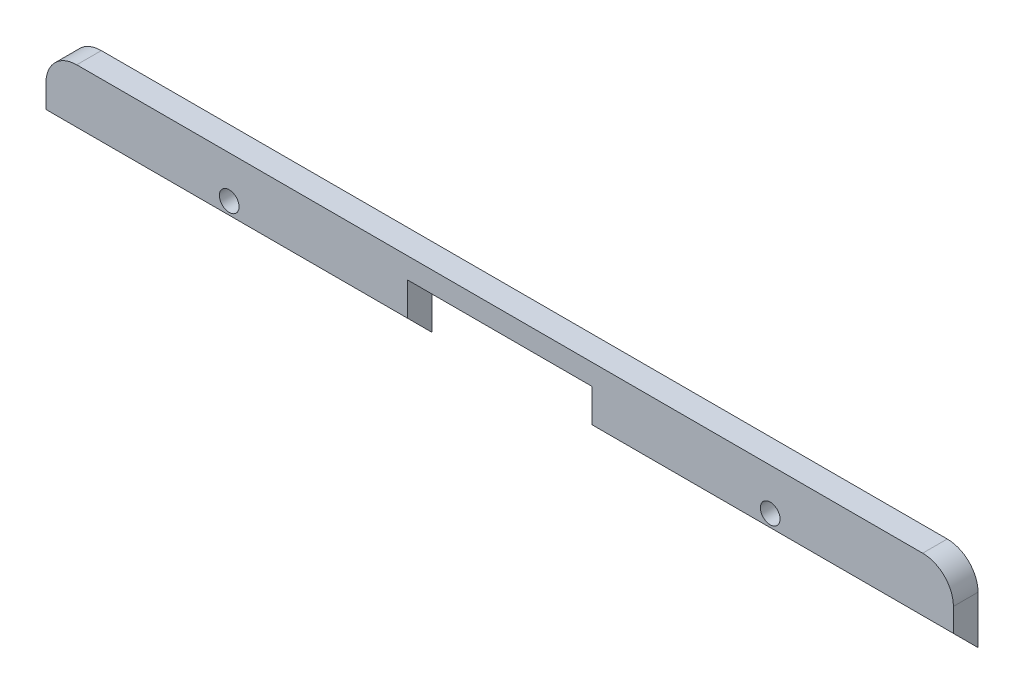
ISO-10303-21;
HEADER;
FILE_DESCRIPTION(('STEP AP214'),'2;1');
FILE_NAME('part.step','',(''),(''),'','','');
FILE_SCHEMA(('AUTOMOTIVE_DESIGN { 1 0 10303 214 1 1 1 1 }'));
ENDSEC;
DATA;
#1=APPLICATION_CONTEXT('core data for automotive mechanical design processes');
#2=APPLICATION_PROTOCOL_DEFINITION('international standard','automotive_design',2000,#1);
#3=PRODUCT_CONTEXT('',#1,'mechanical');
#4=PRODUCT('Part','Part','',(#3));
#5=PRODUCT_RELATED_PRODUCT_CATEGORY('part','',(#4));
#6=PRODUCT_DEFINITION_FORMATION('','',#4);
#7=PRODUCT_DEFINITION_CONTEXT('part definition',#1,'design');
#8=PRODUCT_DEFINITION('design','',#6,#7);
#9=PRODUCT_DEFINITION_SHAPE('','',#8);
#10=(LENGTH_UNIT() NAMED_UNIT(*) SI_UNIT(.MILLI.,.METRE.));
#11=(NAMED_UNIT(*) PLANE_ANGLE_UNIT() SI_UNIT($,.RADIAN.));
#12=(NAMED_UNIT(*) SI_UNIT($,.STERADIAN.) SOLID_ANGLE_UNIT());
#13=UNCERTAINTY_MEASURE_WITH_UNIT(LENGTH_MEASURE(1.E-05),#10,'distance_accuracy_value','');
#14=(GEOMETRIC_REPRESENTATION_CONTEXT(3) GLOBAL_UNCERTAINTY_ASSIGNED_CONTEXT((#13)) GLOBAL_UNIT_ASSIGNED_CONTEXT((#10,
#11,#12)) REPRESENTATION_CONTEXT('',''));
#15=CARTESIAN_POINT('',(0.,0.,0.));
#16=DIRECTION('',(0.,0.,1.));
#17=DIRECTION('',(1.,0.,0.));
#18=AXIS2_PLACEMENT_3D('',#15,#16,#17);
#19=CARTESIAN_POINT('',(36.9,-3.2,0.));
#20=DIRECTION('',(0.,0.,1.));
#21=DIRECTION('',(1.,0.,0.));
#22=AXIS2_PLACEMENT_3D('',#19,#20,#21);
#23=PLANE('',#22);
#24=CARTESIAN_POINT('',(-22.,-0.199999999999971,0.));
#25=DIRECTION('',(0.,0.,1.));
#26=DIRECTION('',(1.,0.,0.));
#27=AXIS2_PLACEMENT_3D('',#24,#25,#26);
#28=CIRCLE('',#27,0.799999999999988);
#29=CARTESIAN_POINT('',(-21.2,-0.199999999999971,0.));
#30=VERTEX_POINT('',#29);
#31=EDGE_CURVE('E176',#30,#30,#28,.T.);
#32=ORIENTED_EDGE('',*,*,#31,.T.);
#33=EDGE_LOOP('',(#32));
#34=FACE_BOUND('',#33,.T.);
#35=CARTESIAN_POINT('',(22.,-0.199999999999978,0.));
#36=DIRECTION('',(0.,0.,1.));
#37=DIRECTION('',(1.,0.,0.));
#38=AXIS2_PLACEMENT_3D('',#35,#36,#37);
#39=CIRCLE('',#38,0.799999999999988);
#40=CARTESIAN_POINT('',(22.8,-0.199999999999978,0.));
#41=VERTEX_POINT('',#40);
#42=EDGE_CURVE('E168',#41,#41,#39,.T.);
#43=ORIENTED_EDGE('',*,*,#42,.T.);
#44=EDGE_LOOP('',(#43));
#45=FACE_BOUND('',#44,.T.);
#46=DIRECTION('',(0.,1.,0.));
#47=VECTOR('',#46,1.);
#48=CARTESIAN_POINT('',(-36.9,-3.2,0.));
#49=LINE('',#48,#47);
#50=CARTESIAN_POINT('',(-36.9,-3.2,0.));
#51=VERTEX_POINT('',#50);
#52=CARTESIAN_POINT('',(-36.9,0.7,0.));
#53=VERTEX_POINT('',#52);
#54=EDGE_CURVE('E180',#51,#53,#49,.T.);
#55=ORIENTED_EDGE('',*,*,#54,.T.);
#56=CARTESIAN_POINT('',(-34.4,0.7,0.));
#57=DIRECTION('',(0.,0.,1.));
#58=DIRECTION('',(1.,0.,0.));
#59=AXIS2_PLACEMENT_3D('',#56,#57,#58);
#60=CIRCLE('',#59,2.5);
#61=CARTESIAN_POINT('',(-34.4,3.2,0.));
#62=VERTEX_POINT('',#61);
#63=EDGE_CURVE('E47',#53,#62,#60,.F.);
#64=ORIENTED_EDGE('',*,*,#63,.T.);
#65=DIRECTION('',(-1.,0.,0.));
#66=VECTOR('',#65,1.);
#67=CARTESIAN_POINT('',(36.9,3.2,0.));
#68=LINE('',#67,#66);
#69=CARTESIAN_POINT('',(34.4,3.2,0.));
#70=VERTEX_POINT('',#69);
#71=EDGE_CURVE('E211',#70,#62,#68,.T.);
#72=ORIENTED_EDGE('',*,*,#71,.F.);
#73=CARTESIAN_POINT('',(34.4,0.7,0.));
#74=DIRECTION('',(0.,0.,1.));
#75=DIRECTION('',(1.,0.,0.));
#76=AXIS2_PLACEMENT_3D('',#73,#74,#75);
#77=CIRCLE('',#76,2.5);
#78=CARTESIAN_POINT('',(36.9,0.7,0.));
#79=VERTEX_POINT('',#78);
#80=EDGE_CURVE('E54',#70,#79,#77,.F.);
#81=ORIENTED_EDGE('',*,*,#80,.T.);
#82=DIRECTION('',(0.,1.,0.));
#83=VECTOR('',#82,1.);
#84=CARTESIAN_POINT('',(36.9,-3.2,0.));
#85=LINE('',#84,#83);
#86=CARTESIAN_POINT('',(36.9,-3.2,0.));
#87=VERTEX_POINT('',#86);
#88=EDGE_CURVE('E181',#87,#79,#85,.T.);
#89=ORIENTED_EDGE('',*,*,#88,.F.);
#90=DIRECTION('',(-1.,0.,0.));
#91=VECTOR('',#90,1.);
#92=CARTESIAN_POINT('',(36.9,-3.2,0.));
#93=LINE('',#92,#91);
#94=CARTESIAN_POINT('',(7.50000000000002,-3.20000000000006,0.));
#95=VERTEX_POINT('',#94);
#96=EDGE_CURVE('E200',#87,#95,#93,.T.);
#97=ORIENTED_EDGE('',*,*,#96,.T.);
#98=DIRECTION('',(0.,1.,0.));
#99=VECTOR('',#98,1.);
#100=CARTESIAN_POINT('',(7.50000000000001,1.49999999999994,0.));
#101=LINE('',#100,#99);
#102=CARTESIAN_POINT('',(7.50000000000001,1.49999999999994,0.));
#103=VERTEX_POINT('',#102);
#104=EDGE_CURVE('E155',#95,#103,#101,.T.);
#105=ORIENTED_EDGE('',*,*,#104,.T.);
#106=DIRECTION('',(-1.,0.,0.));
#107=VECTOR('',#106,1.);
#108=CARTESIAN_POINT('',(7.50000000000001,1.49999999999994,0.));
#109=LINE('',#108,#107);
#110=CARTESIAN_POINT('',(-7.50000000000001,1.49999999999994,0.));
#111=VERTEX_POINT('',#110);
#112=EDGE_CURVE('E139',#103,#111,#109,.T.);
#113=ORIENTED_EDGE('',*,*,#112,.T.);
#114=DIRECTION('',(0.,-1.,0.));
#115=VECTOR('',#114,1.);
#116=CARTESIAN_POINT('',(-7.50000000000001,1.49999999999994,0.));
#117=LINE('',#116,#115);
#118=CARTESIAN_POINT('',(-7.50000000000001,-3.20000000000006,0.));
#119=VERTEX_POINT('',#118);
#120=EDGE_CURVE('E133',#111,#119,#117,.T.);
#121=ORIENTED_EDGE('',*,*,#120,.T.);
#122=EDGE_CURVE('E191',#119,#51,#93,.T.);
#123=ORIENTED_EDGE('',*,*,#122,.T.);
#124=EDGE_LOOP('',(#55,#64,#72,#81,#89,#97,#105,#113,#121,#123));
#125=FACE_BOUND('',#124,.T.);
#126=ADVANCED_FACE('F38',(#34,#45,#125),#23,.F.);
#127=CARTESIAN_POINT('',(36.9,-1.2,2.));
#128=DIRECTION('',(0.,0.,-1.));
#129=DIRECTION('',(-1.,0.,0.));
#130=AXIS2_PLACEMENT_3D('',#127,#128,#129);
#131=PLANE('',#130);
#132=CARTESIAN_POINT('',(-22.,-0.199999999999971,2.));
#133=DIRECTION('',(0.,0.,1.));
#134=DIRECTION('',(1.,0.,0.));
#135=AXIS2_PLACEMENT_3D('',#132,#133,#134);
#136=CIRCLE('',#135,0.799999999999988);
#137=CARTESIAN_POINT('',(-21.2,-0.199999999999971,2.));
#138=VERTEX_POINT('',#137);
#139=EDGE_CURVE('E172',#138,#138,#136,.T.);
#140=ORIENTED_EDGE('',*,*,#139,.F.);
#141=EDGE_LOOP('',(#140));
#142=FACE_BOUND('',#141,.T.);
#143=CARTESIAN_POINT('',(22.,-0.199999999999978,2.));
#144=DIRECTION('',(0.,0.,1.));
#145=DIRECTION('',(1.,0.,0.));
#146=AXIS2_PLACEMENT_3D('',#143,#144,#145);
#147=CIRCLE('',#146,0.799999999999988);
#148=CARTESIAN_POINT('',(22.8,-0.199999999999978,2.));
#149=VERTEX_POINT('',#148);
#150=EDGE_CURVE('E141',#149,#149,#147,.T.);
#151=ORIENTED_EDGE('',*,*,#150,.F.);
#152=EDGE_LOOP('',(#151));
#153=FACE_BOUND('',#152,.T.);
#154=DIRECTION('',(-1.,0.,0.));
#155=VECTOR('',#154,1.);
#156=CARTESIAN_POINT('',(36.9,3.2,2.));
#157=LINE('',#156,#155);
#158=CARTESIAN_POINT('',(34.4,3.2,2.));
#159=VERTEX_POINT('',#158);
#160=CARTESIAN_POINT('',(-34.4,3.2,2.));
#161=VERTEX_POINT('',#160);
#162=EDGE_CURVE('E208',#159,#161,#157,.T.);
#163=ORIENTED_EDGE('',*,*,#162,.T.);
#164=CARTESIAN_POINT('',(-34.4,0.7,2.));
#165=DIRECTION('',(0.,0.,-1.));
#166=DIRECTION('',(-1.,0.,0.));
#167=AXIS2_PLACEMENT_3D('',#164,#165,#166);
#168=CIRCLE('',#167,2.5);
#169=CARTESIAN_POINT('',(-36.9,0.7,2.));
#170=VERTEX_POINT('',#169);
#171=EDGE_CURVE('E229',#161,#170,#168,.F.);
#172=ORIENTED_EDGE('',*,*,#171,.T.);
#173=DIRECTION('',(0.,-1.,0.));
#174=VECTOR('',#173,1.);
#175=CARTESIAN_POINT('',(-36.9,-1.2,2.));
#176=LINE('',#175,#174);
#177=CARTESIAN_POINT('',(-36.9,-1.2,2.));
#178=VERTEX_POINT('',#177);
#179=EDGE_CURVE('E194',#170,#178,#176,.T.);
#180=ORIENTED_EDGE('',*,*,#179,.T.);
#181=DIRECTION('',(-1.,0.,0.));
#182=VECTOR('',#181,1.);
#183=CARTESIAN_POINT('',(36.9,-1.2,2.));
#184=LINE('',#183,#182);
#185=CARTESIAN_POINT('',(-7.50000000000001,-1.2,2.));
#186=VERTEX_POINT('',#185);
#187=EDGE_CURVE('E204',#186,#178,#184,.T.);
#188=ORIENTED_EDGE('',*,*,#187,.F.);
#189=DIRECTION('',(0.,-1.,0.));
#190=VECTOR('',#189,1.);
#191=CARTESIAN_POINT('',(-7.50000000000001,1.49999999999994,2.));
#192=LINE('',#191,#190);
#193=CARTESIAN_POINT('',(-7.50000000000001,1.49999999999994,2.));
#194=VERTEX_POINT('',#193);
#195=EDGE_CURVE('E148',#194,#186,#192,.T.);
#196=ORIENTED_EDGE('',*,*,#195,.F.);
#197=DIRECTION('',(-1.,0.,0.));
#198=VECTOR('',#197,1.);
#199=CARTESIAN_POINT('',(7.50000000000001,1.49999999999994,2.));
#200=LINE('',#199,#198);
#201=CARTESIAN_POINT('',(7.50000000000001,1.49999999999994,2.));
#202=VERTEX_POINT('',#201);
#203=EDGE_CURVE('E132',#202,#194,#200,.T.);
#204=ORIENTED_EDGE('',*,*,#203,.F.);
#205=DIRECTION('',(0.,1.,0.));
#206=VECTOR('',#205,1.);
#207=CARTESIAN_POINT('',(7.50000000000001,1.49999999999994,2.));
#208=LINE('',#207,#206);
#209=CARTESIAN_POINT('',(7.50000000000002,-1.2,2.));
#210=VERTEX_POINT('',#209);
#211=EDGE_CURVE('E120',#210,#202,#208,.T.);
#212=ORIENTED_EDGE('',*,*,#211,.F.);
#213=CARTESIAN_POINT('',(36.9,-1.2,2.));
#214=VERTEX_POINT('',#213);
#215=EDGE_CURVE('E205',#214,#210,#184,.T.);
#216=ORIENTED_EDGE('',*,*,#215,.F.);
#217=DIRECTION('',(0.,-1.,0.));
#218=VECTOR('',#217,1.);
#219=CARTESIAN_POINT('',(36.9,-1.2,2.));
#220=LINE('',#219,#218);
#221=CARTESIAN_POINT('',(36.9,0.7,2.));
#222=VERTEX_POINT('',#221);
#223=EDGE_CURVE('E184',#222,#214,#220,.T.);
#224=ORIENTED_EDGE('',*,*,#223,.F.);
#225=CARTESIAN_POINT('',(34.4,0.7,2.));
#226=DIRECTION('',(0.,0.,-1.));
#227=DIRECTION('',(-1.,0.,0.));
#228=AXIS2_PLACEMENT_3D('',#225,#226,#227);
#229=CIRCLE('',#228,2.5);
#230=EDGE_CURVE('E227',#222,#159,#229,.F.);
#231=ORIENTED_EDGE('',*,*,#230,.T.);
#232=EDGE_LOOP('',(#163,#172,#180,#188,#196,#204,#212,#216,#224,#231));
#233=FACE_BOUND('',#232,.T.);
#234=ADVANCED_FACE('F146',(#142,#153,#233),#131,.F.);
#235=CARTESIAN_POINT('',(36.9,-3.2,0.));
#236=DIRECTION('',(0.,0.707106781186548,-0.707106781186547));
#237=DIRECTION('',(0.,0.707106781186547,0.707106781186548));
#238=AXIS2_PLACEMENT_3D('',#235,#236,#237);
#239=PLANE('',#238);
#240=DIRECTION('',(0.,0.707106781186547,0.707106781186548));
#241=VECTOR('',#240,1.);
#242=CARTESIAN_POINT('',(7.50000000000001,-3.2,0.));
#243=LINE('',#242,#241);
#244=EDGE_CURVE('E126',#95,#210,#243,.T.);
#245=ORIENTED_EDGE('',*,*,#244,.F.);
#246=ORIENTED_EDGE('',*,*,#96,.F.);
#247=DIRECTION('',(0.,-0.707106781186547,-0.707106781186548));
#248=VECTOR('',#247,1.);
#249=CARTESIAN_POINT('',(36.9,-3.2,0.));
#250=LINE('',#249,#248);
#251=EDGE_CURVE('E188',#214,#87,#250,.T.);
#252=ORIENTED_EDGE('',*,*,#251,.F.);
#253=ORIENTED_EDGE('',*,*,#215,.T.);
#254=EDGE_LOOP('',(#245,#246,#252,#253));
#255=FACE_BOUND('',#254,.T.);
#256=ADVANCED_FACE('F258',(#255),#239,.F.);
#257=DIRECTION('',(0.,-0.707106781186547,-0.707106781186548));
#258=VECTOR('',#257,1.);
#259=CARTESIAN_POINT('',(-7.50000000000001,-3.2,0.));
#260=LINE('',#259,#258);
#261=EDGE_CURVE('E215',#186,#119,#260,.T.);
#262=ORIENTED_EDGE('',*,*,#261,.F.);
#263=ORIENTED_EDGE('',*,*,#187,.T.);
#264=DIRECTION('',(0.,-0.707106781186547,-0.707106781186548));
#265=VECTOR('',#264,1.);
#266=CARTESIAN_POINT('',(-36.9,-3.2,0.));
#267=LINE('',#266,#265);
#268=EDGE_CURVE('E185',#178,#51,#267,.T.);
#269=ORIENTED_EDGE('',*,*,#268,.T.);
#270=ORIENTED_EDGE('',*,*,#122,.F.);
#271=EDGE_LOOP('',(#262,#263,#269,#270));
#272=FACE_BOUND('',#271,.T.);
#273=ADVANCED_FACE('F251',(#272),#239,.F.);
#274=CARTESIAN_POINT('',(36.9,3.2,2.));
#275=DIRECTION('',(0.,-1.,0.));
#276=DIRECTION('',(0.,0.,-1.));
#277=AXIS2_PLACEMENT_3D('',#274,#275,#276);
#278=PLANE('',#277);
#279=ORIENTED_EDGE('',*,*,#71,.T.);
#280=DIRECTION('',(0.,0.,1.));
#281=VECTOR('',#280,1.);
#282=CARTESIAN_POINT('',(-34.4,3.2,2.));
#283=LINE('',#282,#281);
#284=EDGE_CURVE('E223',#62,#161,#283,.T.);
#285=ORIENTED_EDGE('',*,*,#284,.T.);
#286=ORIENTED_EDGE('',*,*,#162,.F.);
#287=DIRECTION('',(0.,0.,1.));
#288=VECTOR('',#287,1.);
#289=CARTESIAN_POINT('',(34.4,3.2,2.));
#290=LINE('',#289,#288);
#291=EDGE_CURVE('E220',#159,#70,#290,.F.);
#292=ORIENTED_EDGE('',*,*,#291,.T.);
#293=EDGE_LOOP('',(#279,#285,#286,#292));
#294=FACE_BOUND('',#293,.T.);
#295=ADVANCED_FACE('F241',(#294),#278,.F.);
#296=CARTESIAN_POINT('',(36.9,0.,0.));
#297=DIRECTION('',(-1.,0.,0.));
#298=DIRECTION('',(0.,0.,1.));
#299=AXIS2_PLACEMENT_3D('',#296,#297,#298);
#300=PLANE('',#299);
#301=ORIENTED_EDGE('',*,*,#88,.T.);
#302=DIRECTION('',(0.,0.,1.));
#303=VECTOR('',#302,1.);
#304=CARTESIAN_POINT('',(36.9,0.7,0.));
#305=LINE('',#304,#303);
#306=EDGE_CURVE('E11',#79,#222,#305,.T.);
#307=ORIENTED_EDGE('',*,*,#306,.T.);
#308=ORIENTED_EDGE('',*,*,#223,.T.);
#309=ORIENTED_EDGE('',*,*,#251,.T.);
#310=EDGE_LOOP('',(#301,#307,#308,#309));
#311=FACE_BOUND('',#310,.T.);
#312=ADVANCED_FACE('F262',(#311),#300,.F.);
#313=CARTESIAN_POINT('',(-36.9,0.,0.));
#314=DIRECTION('',(-1.,0.,0.));
#315=DIRECTION('',(0.,0.,1.));
#316=AXIS2_PLACEMENT_3D('',#313,#314,#315);
#317=PLANE('',#316);
#318=ORIENTED_EDGE('',*,*,#179,.F.);
#319=DIRECTION('',(0.,0.,1.));
#320=VECTOR('',#319,1.);
#321=CARTESIAN_POINT('',(-36.9,0.7,0.));
#322=LINE('',#321,#320);
#323=EDGE_CURVE('E62',#170,#53,#322,.F.);
#324=ORIENTED_EDGE('',*,*,#323,.T.);
#325=ORIENTED_EDGE('',*,*,#54,.F.);
#326=ORIENTED_EDGE('',*,*,#268,.F.);
#327=EDGE_LOOP('',(#318,#324,#325,#326));
#328=FACE_BOUND('',#327,.T.);
#329=ADVANCED_FACE('F247',(#328),#317,.T.);
#330=CARTESIAN_POINT('',(-22.,-0.199999999999971,2.));
#331=DIRECTION('',(0.,0.,1.));
#332=DIRECTION('',(1.,0.,0.));
#333=AXIS2_PLACEMENT_3D('',#330,#331,#332);
#334=CYLINDRICAL_SURFACE('',#333,0.799999999999988);
#335=ORIENTED_EDGE('',*,*,#31,.F.);
#336=EDGE_LOOP('',(#335));
#337=FACE_BOUND('',#336,.T.);
#338=ORIENTED_EDGE('',*,*,#139,.T.);
#339=EDGE_LOOP('',(#338));
#340=FACE_BOUND('',#339,.T.);
#341=ADVANCED_FACE('F285',(#337,#340),#334,.F.);
#342=CARTESIAN_POINT('',(22.,-0.199999999999978,2.));
#343=DIRECTION('',(0.,0.,1.));
#344=DIRECTION('',(1.,0.,0.));
#345=AXIS2_PLACEMENT_3D('',#342,#343,#344);
#346=CYLINDRICAL_SURFACE('',#345,0.799999999999988);
#347=ORIENTED_EDGE('',*,*,#42,.F.);
#348=EDGE_LOOP('',(#347));
#349=FACE_BOUND('',#348,.T.);
#350=ORIENTED_EDGE('',*,*,#150,.T.);
#351=EDGE_LOOP('',(#350));
#352=FACE_BOUND('',#351,.T.);
#353=ADVANCED_FACE('F290',(#349,#352),#346,.F.);
#354=CARTESIAN_POINT('',(7.50000000000001,1.49999999999994,2.));
#355=DIRECTION('',(-1.,0.,0.));
#356=DIRECTION('',(0.,-1.,0.));
#357=AXIS2_PLACEMENT_3D('',#354,#355,#356);
#358=PLANE('',#357);
#359=ORIENTED_EDGE('',*,*,#244,.T.);
#360=ORIENTED_EDGE('',*,*,#211,.T.);
#361=DIRECTION('',(0.,0.,-1.));
#362=VECTOR('',#361,1.);
#363=CARTESIAN_POINT('',(7.50000000000001,1.49999999999994,2.));
#364=LINE('',#363,#362);
#365=EDGE_CURVE('E123',#202,#103,#364,.T.);
#366=ORIENTED_EDGE('',*,*,#365,.T.);
#367=ORIENTED_EDGE('',*,*,#104,.F.);
#368=EDGE_LOOP('',(#359,#360,#366,#367));
#369=FACE_BOUND('',#368,.T.);
#370=ADVANCED_FACE('F122',(#369),#358,.T.);
#371=CARTESIAN_POINT('',(-7.50000000000001,1.49999999999994,2.));
#372=DIRECTION('',(1.,0.,0.));
#373=DIRECTION('',(0.,1.,0.));
#374=AXIS2_PLACEMENT_3D('',#371,#372,#373);
#375=PLANE('',#374);
#376=ORIENTED_EDGE('',*,*,#261,.T.);
#377=ORIENTED_EDGE('',*,*,#120,.F.);
#378=DIRECTION('',(0.,0.,-1.));
#379=VECTOR('',#378,1.);
#380=CARTESIAN_POINT('',(-7.50000000000001,1.49999999999994,2.));
#381=LINE('',#380,#379);
#382=EDGE_CURVE('E142',#194,#111,#381,.T.);
#383=ORIENTED_EDGE('',*,*,#382,.F.);
#384=ORIENTED_EDGE('',*,*,#195,.T.);
#385=EDGE_LOOP('',(#376,#377,#383,#384));
#386=FACE_BOUND('',#385,.T.);
#387=ADVANCED_FACE('F255',(#386),#375,.T.);
#388=CARTESIAN_POINT('',(7.50000000000001,1.49999999999994,2.));
#389=DIRECTION('',(0.,-1.,0.));
#390=DIRECTION('',(1.,0.,0.));
#391=AXIS2_PLACEMENT_3D('',#388,#389,#390);
#392=PLANE('',#391);
#393=ORIENTED_EDGE('',*,*,#112,.F.);
#394=ORIENTED_EDGE('',*,*,#365,.F.);
#395=ORIENTED_EDGE('',*,*,#203,.T.);
#396=ORIENTED_EDGE('',*,*,#382,.T.);
#397=EDGE_LOOP('',(#393,#394,#395,#396));
#398=FACE_BOUND('',#397,.T.);
#399=ADVANCED_FACE('F136',(#398),#392,.T.);
#400=CARTESIAN_POINT('',(-34.4,0.7,2.));
#401=DIRECTION('',(0.,0.,-1.));
#402=DIRECTION('',(-1.,0.,0.));
#403=AXIS2_PLACEMENT_3D('',#400,#401,#402);
#404=CYLINDRICAL_SURFACE('',#403,2.5);
#405=ORIENTED_EDGE('',*,*,#63,.F.);
#406=ORIENTED_EDGE('',*,*,#323,.F.);
#407=ORIENTED_EDGE('',*,*,#171,.F.);
#408=ORIENTED_EDGE('',*,*,#284,.F.);
#409=EDGE_LOOP('',(#405,#406,#407,#408));
#410=FACE_BOUND('',#409,.T.);
#411=ADVANCED_FACE('F244',(#410),#404,.T.);
#412=CARTESIAN_POINT('',(34.4,0.7,0.));
#413=DIRECTION('',(0.,0.,1.));
#414=DIRECTION('',(1.,0.,0.));
#415=AXIS2_PLACEMENT_3D('',#412,#413,#414);
#416=CYLINDRICAL_SURFACE('',#415,2.5);
#417=ORIENTED_EDGE('',*,*,#80,.F.);
#418=ORIENTED_EDGE('',*,*,#291,.F.);
#419=ORIENTED_EDGE('',*,*,#230,.F.);
#420=ORIENTED_EDGE('',*,*,#306,.F.);
#421=EDGE_LOOP('',(#417,#418,#419,#420));
#422=FACE_BOUND('',#421,.T.);
#423=ADVANCED_FACE('F40',(#422),#416,.T.);
#424=CLOSED_SHELL('',(#126,#234,#256,#273,#295,#312,#329,#341,#353,#370,#387,#399,#411,#423));
#425=MANIFOLD_SOLID_BREP('B2',#424);
#426=ADVANCED_BREP_SHAPE_REPRESENTATION('',(#18,#425),#14);
#427=SHAPE_DEFINITION_REPRESENTATION(#9,#426);
ENDSEC;
END-ISO-10303-21;
